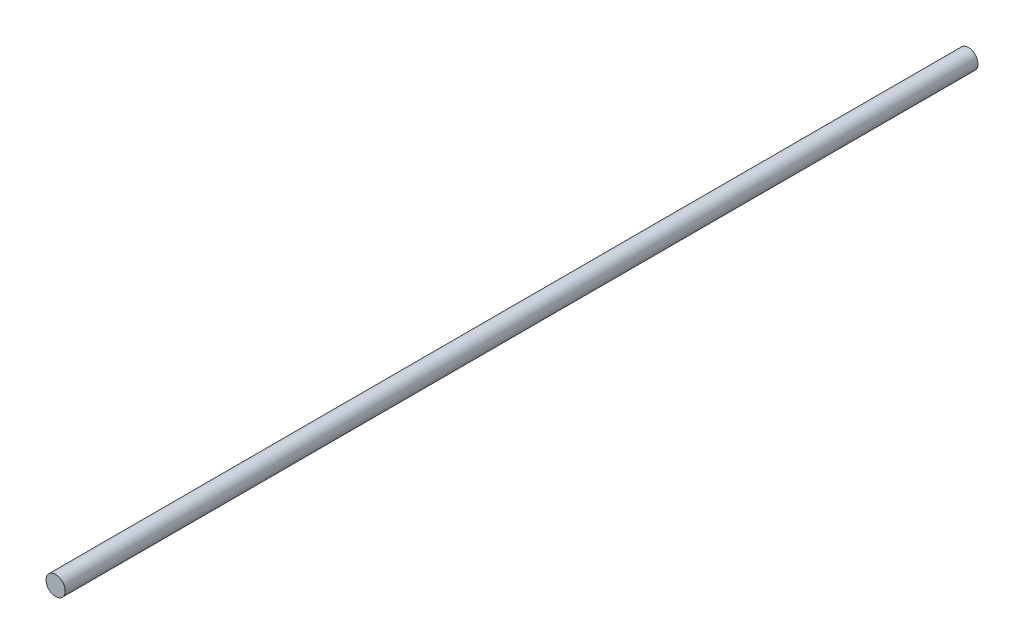
ISO-10303-21;
HEADER;
FILE_DESCRIPTION(('STEP AP214'),'2;1');
FILE_NAME('part.step','',(''),(''),'','','');
FILE_SCHEMA(('AUTOMOTIVE_DESIGN { 1 0 10303 214 1 1 1 1 }'));
ENDSEC;
DATA;
#1=APPLICATION_CONTEXT('core data for automotive mechanical design processes');
#2=APPLICATION_PROTOCOL_DEFINITION('international standard','automotive_design',2000,#1);
#3=PRODUCT_CONTEXT('',#1,'mechanical');
#4=PRODUCT('Part','Part','',(#3));
#5=PRODUCT_RELATED_PRODUCT_CATEGORY('part','',(#4));
#6=PRODUCT_DEFINITION_FORMATION('','',#4);
#7=PRODUCT_DEFINITION_CONTEXT('part definition',#1,'design');
#8=PRODUCT_DEFINITION('design','',#6,#7);
#9=PRODUCT_DEFINITION_SHAPE('','',#8);
#10=(LENGTH_UNIT() NAMED_UNIT(*) SI_UNIT(.MILLI.,.METRE.));
#11=(NAMED_UNIT(*) PLANE_ANGLE_UNIT() SI_UNIT($,.RADIAN.));
#12=(NAMED_UNIT(*) SI_UNIT($,.STERADIAN.) SOLID_ANGLE_UNIT());
#13=UNCERTAINTY_MEASURE_WITH_UNIT(LENGTH_MEASURE(1.E-05),#10,'distance_accuracy_value','');
#14=(GEOMETRIC_REPRESENTATION_CONTEXT(3) GLOBAL_UNCERTAINTY_ASSIGNED_CONTEXT((#13)) GLOBAL_UNIT_ASSIGNED_CONTEXT((#10,
#11,#12)) REPRESENTATION_CONTEXT('',''));
#15=CARTESIAN_POINT('',(0.,0.,0.));
#16=DIRECTION('',(0.,0.,1.));
#17=DIRECTION('',(1.,0.,0.));
#18=AXIS2_PLACEMENT_3D('',#15,#16,#17);
#19=CARTESIAN_POINT('',(20.,0.,-95.));
#20=DIRECTION('',(0.,0.,1.));
#21=DIRECTION('',(1.,0.,0.));
#22=AXIS2_PLACEMENT_3D('',#19,#20,#21);
#23=CYLINDRICAL_SURFACE('',#22,1.);
#24=CARTESIAN_POINT('',(20.,0.,-95.));
#25=DIRECTION('',(0.,0.,1.));
#26=DIRECTION('',(1.,0.,0.));
#27=AXIS2_PLACEMENT_3D('',#24,#25,#26);
#28=CIRCLE('',#27,1.);
#29=CARTESIAN_POINT('',(21.,0.,-95.));
#30=VERTEX_POINT('',#29);
#31=EDGE_CURVE('E10',#30,#30,#28,.T.);
#32=ORIENTED_EDGE('',*,*,#31,.T.);
#33=EDGE_LOOP('',(#32));
#34=FACE_BOUND('',#33,.T.);
#35=CARTESIAN_POINT('',(20.,0.,0.));
#36=DIRECTION('',(0.,0.,1.));
#37=DIRECTION('',(1.,0.,0.));
#38=AXIS2_PLACEMENT_3D('',#35,#36,#37);
#39=CIRCLE('',#38,1.);
#40=CARTESIAN_POINT('',(21.,0.,0.));
#41=VERTEX_POINT('',#40);
#42=EDGE_CURVE('E36',#41,#41,#39,.T.);
#43=ORIENTED_EDGE('',*,*,#42,.F.);
#44=EDGE_LOOP('',(#43));
#45=FACE_BOUND('',#44,.T.);
#46=ADVANCED_FACE('F33',(#34,#45),#23,.T.);
#47=CARTESIAN_POINT('',(20.,0.,-95.));
#48=DIRECTION('',(0.,0.,1.));
#49=DIRECTION('',(1.,0.,0.));
#50=AXIS2_PLACEMENT_3D('',#47,#48,#49);
#51=PLANE('',#50);
#52=ORIENTED_EDGE('',*,*,#31,.F.);
#53=EDGE_LOOP('',(#52));
#54=FACE_BOUND('',#53,.T.);
#55=ADVANCED_FACE('F48',(#54),#51,.F.);
#56=CARTESIAN_POINT('',(20.,0.,0.));
#57=DIRECTION('',(0.,0.,1.));
#58=DIRECTION('',(1.,0.,0.));
#59=AXIS2_PLACEMENT_3D('',#56,#57,#58);
#60=PLANE('',#59);
#61=ORIENTED_EDGE('',*,*,#42,.T.);
#62=EDGE_LOOP('',(#61));
#63=FACE_BOUND('',#62,.T.);
#64=ADVANCED_FACE('F45',(#63),#60,.T.);
#65=CLOSED_SHELL('',(#46,#55,#64));
#66=MANIFOLD_SOLID_BREP('B2',#65);
#67=ADVANCED_BREP_SHAPE_REPRESENTATION('',(#18,#66),#14);
#68=SHAPE_DEFINITION_REPRESENTATION(#9,#67);
ENDSEC;
END-ISO-10303-21;
